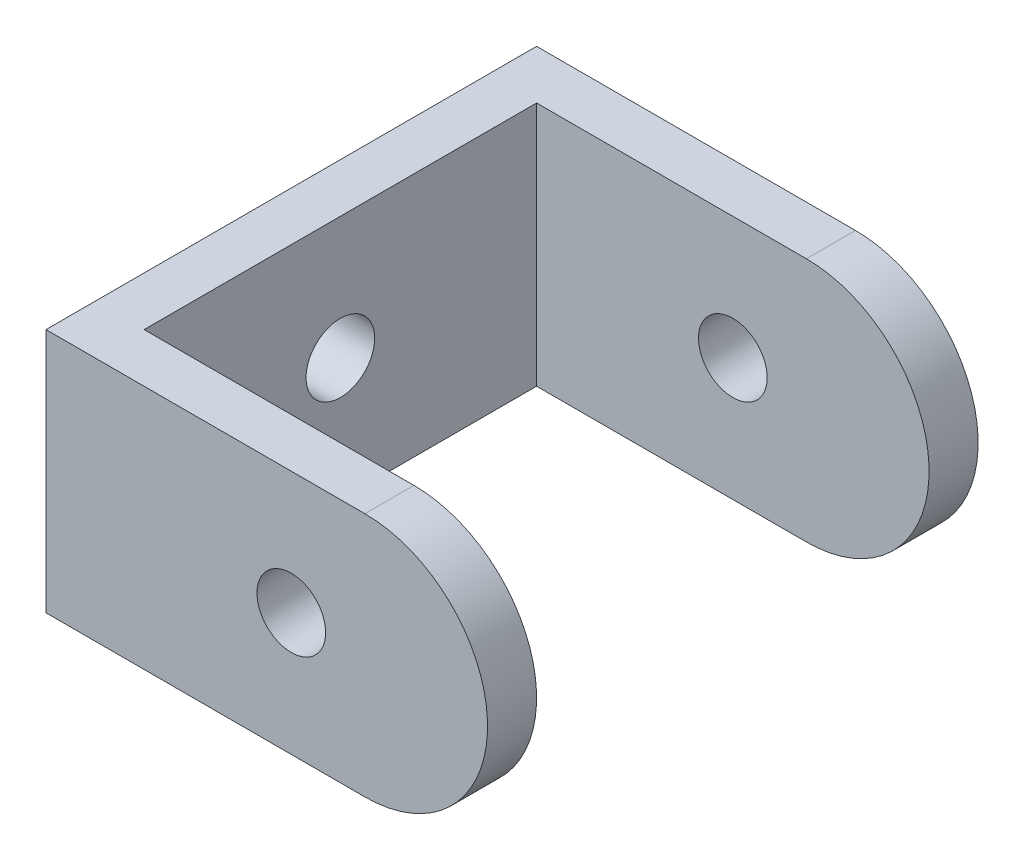
ISO-10303-21;
HEADER;
FILE_DESCRIPTION(('STEP AP214'),'2;1');
FILE_NAME('part.step','',(''),(''),'','','');
FILE_SCHEMA(('AUTOMOTIVE_DESIGN { 1 0 10303 214 1 1 1 1 }'));
ENDSEC;
DATA;
#1=APPLICATION_CONTEXT('core data for automotive mechanical design processes');
#2=APPLICATION_PROTOCOL_DEFINITION('international standard','automotive_design',2000,#1);
#3=PRODUCT_CONTEXT('',#1,'mechanical');
#4=PRODUCT('Part','Part','',(#3));
#5=PRODUCT_RELATED_PRODUCT_CATEGORY('part','',(#4));
#6=PRODUCT_DEFINITION_FORMATION('','',#4);
#7=PRODUCT_DEFINITION_CONTEXT('part definition',#1,'design');
#8=PRODUCT_DEFINITION('design','',#6,#7);
#9=PRODUCT_DEFINITION_SHAPE('','',#8);
#10=(LENGTH_UNIT() NAMED_UNIT(*) SI_UNIT(.MILLI.,.METRE.));
#11=(NAMED_UNIT(*) PLANE_ANGLE_UNIT() SI_UNIT($,.RADIAN.));
#12=(NAMED_UNIT(*) SI_UNIT($,.STERADIAN.) SOLID_ANGLE_UNIT());
#13=UNCERTAINTY_MEASURE_WITH_UNIT(LENGTH_MEASURE(1.E-05),#10,'distance_accuracy_value','');
#14=(GEOMETRIC_REPRESENTATION_CONTEXT(3) GLOBAL_UNCERTAINTY_ASSIGNED_CONTEXT((#13)) GLOBAL_UNIT_ASSIGNED_CONTEXT((#10,
#11,#12)) REPRESENTATION_CONTEXT('',''));
#15=CARTESIAN_POINT('',(0.,0.,0.));
#16=DIRECTION('',(0.,0.,1.));
#17=DIRECTION('',(1.,0.,0.));
#18=AXIS2_PLACEMENT_3D('',#15,#16,#17);
#19=CARTESIAN_POINT('',(-25.,25.,-25.));
#20=DIRECTION('',(0.,0.,1.));
#21=DIRECTION('',(1.,0.,0.));
#22=AXIS2_PLACEMENT_3D('',#19,#20,#21);
#23=PLANE('',#22);
#24=CARTESIAN_POINT('',(0.,12.5,-25.));
#25=DIRECTION('',(0.,0.,1.));
#26=DIRECTION('',(1.,0.,0.));
#27=AXIS2_PLACEMENT_3D('',#24,#25,#26);
#28=CIRCLE('',#27,3.5);
#29=CARTESIAN_POINT('',(3.5,12.5,-25.));
#30=VERTEX_POINT('',#29);
#31=EDGE_CURVE('E136',#30,#30,#28,.T.);
#32=ORIENTED_EDGE('',*,*,#31,.T.);
#33=EDGE_LOOP('',(#32));
#34=FACE_BOUND('',#33,.T.);
#35=DIRECTION('',(-1.,0.,0.));
#36=VECTOR('',#35,1.);
#37=CARTESIAN_POINT('',(-25.,25.,-25.));
#38=LINE('',#37,#36);
#39=CARTESIAN_POINT('',(7.49999999999999,25.,-25.));
#40=VERTEX_POINT('',#39);
#41=CARTESIAN_POINT('',(-25.,25.,-25.));
#42=VERTEX_POINT('',#41);
#43=EDGE_CURVE('E110',#40,#42,#38,.T.);
#44=ORIENTED_EDGE('',*,*,#43,.F.);
#45=CARTESIAN_POINT('',(7.49999999999999,12.5,-25.));
#46=DIRECTION('',(0.,0.,1.));
#47=DIRECTION('',(1.,0.,0.));
#48=AXIS2_PLACEMENT_3D('',#45,#46,#47);
#49=CIRCLE('',#48,12.5);
#50=CARTESIAN_POINT('',(7.49999999999999,0.,-25.));
#51=VERTEX_POINT('',#50);
#52=EDGE_CURVE('E97',#40,#51,#49,.F.);
#53=ORIENTED_EDGE('',*,*,#52,.T.);
#54=DIRECTION('',(-1.,0.,0.));
#55=VECTOR('',#54,1.);
#56=CARTESIAN_POINT('',(-25.,0.,-25.));
#57=LINE('',#56,#55);
#58=CARTESIAN_POINT('',(-25.,0.,-25.));
#59=VERTEX_POINT('',#58);
#60=EDGE_CURVE('E129',#51,#59,#57,.T.);
#61=ORIENTED_EDGE('',*,*,#60,.T.);
#62=DIRECTION('',(0.,-1.,0.));
#63=VECTOR('',#62,1.);
#64=CARTESIAN_POINT('',(-25.,25.,-25.));
#65=LINE('',#64,#63);
#66=EDGE_CURVE('E11',#42,#59,#65,.T.);
#67=ORIENTED_EDGE('',*,*,#66,.F.);
#68=EDGE_LOOP('',(#44,#53,#61,#67));
#69=FACE_BOUND('',#68,.T.);
#70=ADVANCED_FACE('F32',(#34,#69),#23,.F.);
#71=CARTESIAN_POINT('',(-25.,25.,25.));
#72=DIRECTION('',(0.,0.,-1.));
#73=DIRECTION('',(-1.,0.,0.));
#74=AXIS2_PLACEMENT_3D('',#71,#72,#73);
#75=PLANE('',#74);
#76=CARTESIAN_POINT('',(0.,12.5,25.));
#77=DIRECTION('',(0.,0.,1.));
#78=DIRECTION('',(1.,0.,0.));
#79=AXIS2_PLACEMENT_3D('',#76,#77,#78);
#80=CIRCLE('',#79,3.5);
#81=CARTESIAN_POINT('',(3.5,12.5,25.));
#82=VERTEX_POINT('',#81);
#83=EDGE_CURVE('E181',#82,#82,#80,.T.);
#84=ORIENTED_EDGE('',*,*,#83,.F.);
#85=EDGE_LOOP('',(#84));
#86=FACE_BOUND('',#85,.T.);
#87=DIRECTION('',(1.,0.,0.));
#88=VECTOR('',#87,1.);
#89=CARTESIAN_POINT('',(-25.,0.,25.));
#90=LINE('',#89,#88);
#91=CARTESIAN_POINT('',(-25.,0.,25.));
#92=VERTEX_POINT('',#91);
#93=CARTESIAN_POINT('',(7.49999999999999,0.,25.));
#94=VERTEX_POINT('',#93);
#95=EDGE_CURVE('E117',#92,#94,#90,.T.);
#96=ORIENTED_EDGE('',*,*,#95,.T.);
#97=CARTESIAN_POINT('',(7.49999999999999,12.5,25.));
#98=DIRECTION('',(0.,0.,1.));
#99=DIRECTION('',(1.,0.,0.));
#100=AXIS2_PLACEMENT_3D('',#97,#98,#99);
#101=CIRCLE('',#100,12.5);
#102=CARTESIAN_POINT('',(7.49999999999999,25.,25.));
#103=VERTEX_POINT('',#102);
#104=EDGE_CURVE('E105',#103,#94,#101,.F.);
#105=ORIENTED_EDGE('',*,*,#104,.F.);
#106=DIRECTION('',(1.,0.,0.));
#107=VECTOR('',#106,1.);
#108=CARTESIAN_POINT('',(-25.,25.,25.));
#109=LINE('',#108,#107);
#110=CARTESIAN_POINT('',(-25.,25.,25.));
#111=VERTEX_POINT('',#110);
#112=EDGE_CURVE('E119',#111,#103,#109,.T.);
#113=ORIENTED_EDGE('',*,*,#112,.F.);
#114=DIRECTION('',(0.,-1.,0.));
#115=VECTOR('',#114,1.);
#116=CARTESIAN_POINT('',(-25.,25.,25.));
#117=LINE('',#116,#115);
#118=EDGE_CURVE('E40',#111,#92,#117,.T.);
#119=ORIENTED_EDGE('',*,*,#118,.T.);
#120=EDGE_LOOP('',(#96,#105,#113,#119));
#121=FACE_BOUND('',#120,.T.);
#122=ADVANCED_FACE('F199',(#86,#121),#75,.F.);
#123=CARTESIAN_POINT('',(-20.,25.,20.));
#124=DIRECTION('',(0.,0.,-1.));
#125=DIRECTION('',(-1.,0.,0.));
#126=AXIS2_PLACEMENT_3D('',#123,#124,#125);
#127=PLANE('',#126);
#128=CARTESIAN_POINT('',(0.,12.5,20.));
#129=DIRECTION('',(0.,0.,-1.));
#130=DIRECTION('',(-1.,0.,0.));
#131=AXIS2_PLACEMENT_3D('',#128,#129,#130);
#132=CIRCLE('',#131,3.5);
#133=CARTESIAN_POINT('',(-3.5,12.5,20.));
#134=VERTEX_POINT('',#133);
#135=EDGE_CURVE('E143',#134,#134,#132,.T.);
#136=ORIENTED_EDGE('',*,*,#135,.F.);
#137=EDGE_LOOP('',(#136));
#138=FACE_BOUND('',#137,.T.);
#139=CARTESIAN_POINT('',(7.49999999999999,12.5,20.));
#140=DIRECTION('',(0.,0.,-1.));
#141=DIRECTION('',(-1.,0.,0.));
#142=AXIS2_PLACEMENT_3D('',#139,#140,#141);
#143=CIRCLE('',#142,12.5);
#144=CARTESIAN_POINT('',(7.49999999999999,0.,20.));
#145=VERTEX_POINT('',#144);
#146=CARTESIAN_POINT('',(7.49999999999999,25.,20.));
#147=VERTEX_POINT('',#146);
#148=EDGE_CURVE('E177',#145,#147,#143,.F.);
#149=ORIENTED_EDGE('',*,*,#148,.F.);
#150=DIRECTION('',(1.,0.,0.));
#151=VECTOR('',#150,1.);
#152=CARTESIAN_POINT('',(-20.,0.,20.));
#153=LINE('',#152,#151);
#154=CARTESIAN_POINT('',(-20.,0.,20.));
#155=VERTEX_POINT('',#154);
#156=EDGE_CURVE('E140',#155,#145,#153,.T.);
#157=ORIENTED_EDGE('',*,*,#156,.F.);
#158=DIRECTION('',(0.,-1.,0.));
#159=VECTOR('',#158,1.);
#160=CARTESIAN_POINT('',(-20.,25.,20.));
#161=LINE('',#160,#159);
#162=CARTESIAN_POINT('',(-20.,25.,20.));
#163=VERTEX_POINT('',#162);
#164=EDGE_CURVE('E158',#163,#155,#161,.T.);
#165=ORIENTED_EDGE('',*,*,#164,.F.);
#166=DIRECTION('',(1.,0.,0.));
#167=VECTOR('',#166,1.);
#168=CARTESIAN_POINT('',(-20.,25.,20.));
#169=LINE('',#168,#167);
#170=EDGE_CURVE('E151',#163,#147,#169,.T.);
#171=ORIENTED_EDGE('',*,*,#170,.T.);
#172=EDGE_LOOP('',(#149,#157,#165,#171));
#173=FACE_BOUND('',#172,.T.);
#174=ADVANCED_FACE('F192',(#138,#173),#127,.T.);
#175=CARTESIAN_POINT('',(-20.,25.,-20.));
#176=DIRECTION('',(0.,0.,1.));
#177=DIRECTION('',(1.,0.,0.));
#178=AXIS2_PLACEMENT_3D('',#175,#176,#177);
#179=PLANE('',#178);
#180=CARTESIAN_POINT('',(0.,12.5,-20.));
#181=DIRECTION('',(0.,0.,1.));
#182=DIRECTION('',(1.,0.,0.));
#183=AXIS2_PLACEMENT_3D('',#180,#181,#182);
#184=CIRCLE('',#183,3.5);
#185=CARTESIAN_POINT('',(3.5,12.5,-20.));
#186=VERTEX_POINT('',#185);
#187=EDGE_CURVE('E35',#186,#186,#184,.T.);
#188=ORIENTED_EDGE('',*,*,#187,.F.);
#189=EDGE_LOOP('',(#188));
#190=FACE_BOUND('',#189,.T.);
#191=DIRECTION('',(-1.,0.,0.));
#192=VECTOR('',#191,1.);
#193=CARTESIAN_POINT('',(-20.,0.,-20.));
#194=LINE('',#193,#192);
#195=CARTESIAN_POINT('',(7.49999999999999,0.,-20.));
#196=VERTEX_POINT('',#195);
#197=CARTESIAN_POINT('',(-20.,0.,-20.));
#198=VERTEX_POINT('',#197);
#199=EDGE_CURVE('E161',#196,#198,#194,.T.);
#200=ORIENTED_EDGE('',*,*,#199,.F.);
#201=CARTESIAN_POINT('',(7.49999999999999,12.5,-20.));
#202=DIRECTION('',(0.,0.,1.));
#203=DIRECTION('',(1.,0.,0.));
#204=AXIS2_PLACEMENT_3D('',#201,#202,#203);
#205=CIRCLE('',#204,12.5);
#206=CARTESIAN_POINT('',(7.49999999999999,25.,-20.));
#207=VERTEX_POINT('',#206);
#208=EDGE_CURVE('E175',#207,#196,#205,.F.);
#209=ORIENTED_EDGE('',*,*,#208,.F.);
#210=DIRECTION('',(-1.,0.,0.));
#211=VECTOR('',#210,1.);
#212=CARTESIAN_POINT('',(-20.,25.,-20.));
#213=LINE('',#212,#211);
#214=CARTESIAN_POINT('',(-20.,25.,-20.));
#215=VERTEX_POINT('',#214);
#216=EDGE_CURVE('E55',#207,#215,#213,.T.);
#217=ORIENTED_EDGE('',*,*,#216,.T.);
#218=DIRECTION('',(0.,-1.,0.));
#219=VECTOR('',#218,1.);
#220=CARTESIAN_POINT('',(-20.,25.,-20.));
#221=LINE('',#220,#219);
#222=EDGE_CURVE('E125',#215,#198,#221,.T.);
#223=ORIENTED_EDGE('',*,*,#222,.T.);
#224=EDGE_LOOP('',(#200,#209,#217,#223));
#225=FACE_BOUND('',#224,.T.);
#226=ADVANCED_FACE('F169',(#190,#225),#179,.T.);
#227=CARTESIAN_POINT('',(0.,25.,0.));
#228=DIRECTION('',(0.,-1.,0.));
#229=DIRECTION('',(0.,0.,-1.));
#230=AXIS2_PLACEMENT_3D('',#227,#228,#229);
#231=PLANE('',#230);
#232=ORIENTED_EDGE('',*,*,#112,.T.);
#233=DIRECTION('',(0.,0.,1.));
#234=VECTOR('',#233,1.);
#235=CARTESIAN_POINT('',(7.49999999999999,25.,-25.));
#236=LINE('',#235,#234);
#237=EDGE_CURVE('E104',#147,#103,#236,.T.);
#238=ORIENTED_EDGE('',*,*,#237,.F.);
#239=ORIENTED_EDGE('',*,*,#170,.F.);
#240=DIRECTION('',(0.,0.,1.));
#241=VECTOR('',#240,1.);
#242=CARTESIAN_POINT('',(-20.,25.,20.));
#243=LINE('',#242,#241);
#244=EDGE_CURVE('E156',#215,#163,#243,.T.);
#245=ORIENTED_EDGE('',*,*,#244,.F.);
#246=ORIENTED_EDGE('',*,*,#216,.F.);
#247=EDGE_CURVE('E48',#40,#207,#236,.T.);
#248=ORIENTED_EDGE('',*,*,#247,.F.);
#249=ORIENTED_EDGE('',*,*,#43,.T.);
#250=DIRECTION('',(0.,0.,1.));
#251=VECTOR('',#250,1.);
#252=CARTESIAN_POINT('',(-25.,25.,25.));
#253=LINE('',#252,#251);
#254=EDGE_CURVE('E116',#42,#111,#253,.T.);
#255=ORIENTED_EDGE('',*,*,#254,.T.);
#256=EDGE_LOOP('',(#232,#238,#239,#245,#246,#248,#249,#255));
#257=FACE_BOUND('',#256,.T.);
#258=ADVANCED_FACE('F109',(#257),#231,.F.);
#259=CARTESIAN_POINT('',(0.,0.,0.));
#260=DIRECTION('',(0.,-1.,0.));
#261=DIRECTION('',(0.,0.,-1.));
#262=AXIS2_PLACEMENT_3D('',#259,#260,#261);
#263=PLANE('',#262);
#264=DIRECTION('',(0.,0.,1.));
#265=VECTOR('',#264,1.);
#266=CARTESIAN_POINT('',(7.49999999999999,0.,-25.));
#267=LINE('',#266,#265);
#268=EDGE_CURVE('E113',#145,#94,#267,.T.);
#269=ORIENTED_EDGE('',*,*,#268,.T.);
#270=ORIENTED_EDGE('',*,*,#95,.F.);
#271=DIRECTION('',(0.,0.,1.));
#272=VECTOR('',#271,1.);
#273=CARTESIAN_POINT('',(-25.,0.,25.));
#274=LINE('',#273,#272);
#275=EDGE_CURVE('E122',#59,#92,#274,.T.);
#276=ORIENTED_EDGE('',*,*,#275,.F.);
#277=ORIENTED_EDGE('',*,*,#60,.F.);
#278=EDGE_CURVE('E100',#51,#196,#267,.T.);
#279=ORIENTED_EDGE('',*,*,#278,.T.);
#280=ORIENTED_EDGE('',*,*,#199,.T.);
#281=DIRECTION('',(0.,0.,1.));
#282=VECTOR('',#281,1.);
#283=CARTESIAN_POINT('',(-20.,0.,20.));
#284=LINE('',#283,#282);
#285=EDGE_CURVE('E154',#198,#155,#284,.T.);
#286=ORIENTED_EDGE('',*,*,#285,.T.);
#287=ORIENTED_EDGE('',*,*,#156,.T.);
#288=EDGE_LOOP('',(#269,#270,#276,#277,#279,#280,#286,#287));
#289=FACE_BOUND('',#288,.T.);
#290=ADVANCED_FACE('F173',(#289),#263,.T.);
#291=CARTESIAN_POINT('',(-25.,25.,25.));
#292=DIRECTION('',(1.,0.,0.));
#293=DIRECTION('',(0.,0.,-1.));
#294=AXIS2_PLACEMENT_3D('',#291,#292,#293);
#295=PLANE('',#294);
#296=CARTESIAN_POINT('',(-25.,12.5,0.));
#297=DIRECTION('',(1.,0.,0.));
#298=DIRECTION('',(0.,0.,-1.));
#299=AXIS2_PLACEMENT_3D('',#296,#297,#298);
#300=CIRCLE('',#299,3.5);
#301=CARTESIAN_POINT('',(-25.,12.5,-3.5));
#302=VERTEX_POINT('',#301);
#303=EDGE_CURVE('E135',#302,#302,#300,.T.);
#304=ORIENTED_EDGE('',*,*,#303,.T.);
#305=EDGE_LOOP('',(#304));
#306=FACE_BOUND('',#305,.T.);
#307=ORIENTED_EDGE('',*,*,#275,.T.);
#308=ORIENTED_EDGE('',*,*,#118,.F.);
#309=ORIENTED_EDGE('',*,*,#254,.F.);
#310=ORIENTED_EDGE('',*,*,#66,.T.);
#311=EDGE_LOOP('',(#307,#308,#309,#310));
#312=FACE_BOUND('',#311,.T.);
#313=ADVANCED_FACE('F214',(#306,#312),#295,.F.);
#314=CARTESIAN_POINT('',(-20.,25.,20.));
#315=DIRECTION('',(1.,0.,0.));
#316=DIRECTION('',(0.,0.,-1.));
#317=AXIS2_PLACEMENT_3D('',#314,#315,#316);
#318=PLANE('',#317);
#319=CARTESIAN_POINT('',(-20.,12.5,0.));
#320=DIRECTION('',(1.,0.,0.));
#321=DIRECTION('',(0.,0.,-1.));
#322=AXIS2_PLACEMENT_3D('',#319,#320,#321);
#323=CIRCLE('',#322,3.5);
#324=CARTESIAN_POINT('',(-20.,12.5,-3.5));
#325=VERTEX_POINT('',#324);
#326=EDGE_CURVE('E133',#325,#325,#323,.T.);
#327=ORIENTED_EDGE('',*,*,#326,.F.);
#328=EDGE_LOOP('',(#327));
#329=FACE_BOUND('',#328,.T.);
#330=ORIENTED_EDGE('',*,*,#285,.F.);
#331=ORIENTED_EDGE('',*,*,#222,.F.);
#332=ORIENTED_EDGE('',*,*,#244,.T.);
#333=ORIENTED_EDGE('',*,*,#164,.T.);
#334=EDGE_LOOP('',(#330,#331,#332,#333));
#335=FACE_BOUND('',#334,.T.);
#336=ADVANCED_FACE('F170',(#329,#335),#318,.T.);
#337=CARTESIAN_POINT('',(-30.,12.5,0.));
#338=DIRECTION('',(1.,0.,0.));
#339=DIRECTION('',(0.,0.,-1.));
#340=AXIS2_PLACEMENT_3D('',#337,#338,#339);
#341=CYLINDRICAL_SURFACE('',#340,3.5);
#342=ORIENTED_EDGE('',*,*,#326,.T.);
#343=EDGE_LOOP('',(#342));
#344=FACE_BOUND('',#343,.T.);
#345=ORIENTED_EDGE('',*,*,#303,.F.);
#346=EDGE_LOOP('',(#345));
#347=FACE_BOUND('',#346,.T.);
#348=ADVANCED_FACE('F221',(#344,#347),#341,.F.);
#349=CARTESIAN_POINT('',(0.,12.5,-30.));
#350=DIRECTION('',(0.,0.,1.));
#351=DIRECTION('',(1.,0.,0.));
#352=AXIS2_PLACEMENT_3D('',#349,#350,#351);
#353=CYLINDRICAL_SURFACE('',#352,3.5);
#354=ORIENTED_EDGE('',*,*,#187,.T.);
#355=EDGE_LOOP('',(#354));
#356=FACE_BOUND('',#355,.T.);
#357=ORIENTED_EDGE('',*,*,#31,.F.);
#358=EDGE_LOOP('',(#357));
#359=FACE_BOUND('',#358,.T.);
#360=ADVANCED_FACE('F188',(#356,#359),#353,.F.);
#361=ORIENTED_EDGE('',*,*,#135,.T.);
#362=EDGE_LOOP('',(#361));
#363=FACE_BOUND('',#362,.T.);
#364=ORIENTED_EDGE('',*,*,#83,.T.);
#365=EDGE_LOOP('',(#364));
#366=FACE_BOUND('',#365,.T.);
#367=ADVANCED_FACE('F241',(#363,#366),#353,.F.);
#368=CARTESIAN_POINT('',(7.49999999999999,12.5,-25.));
#369=DIRECTION('',(0.,0.,1.));
#370=DIRECTION('',(1.,0.,0.));
#371=AXIS2_PLACEMENT_3D('',#368,#369,#370);
#372=CYLINDRICAL_SURFACE('',#371,12.5);
#373=ORIENTED_EDGE('',*,*,#208,.T.);
#374=ORIENTED_EDGE('',*,*,#278,.F.);
#375=ORIENTED_EDGE('',*,*,#52,.F.);
#376=ORIENTED_EDGE('',*,*,#247,.T.);
#377=EDGE_LOOP('',(#373,#374,#375,#376));
#378=FACE_BOUND('',#377,.T.);
#379=ADVANCED_FACE('F98',(#378),#372,.T.);
#380=ORIENTED_EDGE('',*,*,#148,.T.);
#381=ORIENTED_EDGE('',*,*,#237,.T.);
#382=ORIENTED_EDGE('',*,*,#104,.T.);
#383=ORIENTED_EDGE('',*,*,#268,.F.);
#384=EDGE_LOOP('',(#380,#381,#382,#383));
#385=FACE_BOUND('',#384,.T.);
#386=ADVANCED_FACE('F232',(#385),#372,.T.);
#387=CLOSED_SHELL('',(#70,#122,#174,#226,#258,#290,#313,#336,#348,#360,#367,#379,#386));
#388=MANIFOLD_SOLID_BREP('B2',#387);
#389=ADVANCED_BREP_SHAPE_REPRESENTATION('',(#18,#388),#14);
#390=SHAPE_DEFINITION_REPRESENTATION(#9,#389);
ENDSEC;
END-ISO-10303-21;
